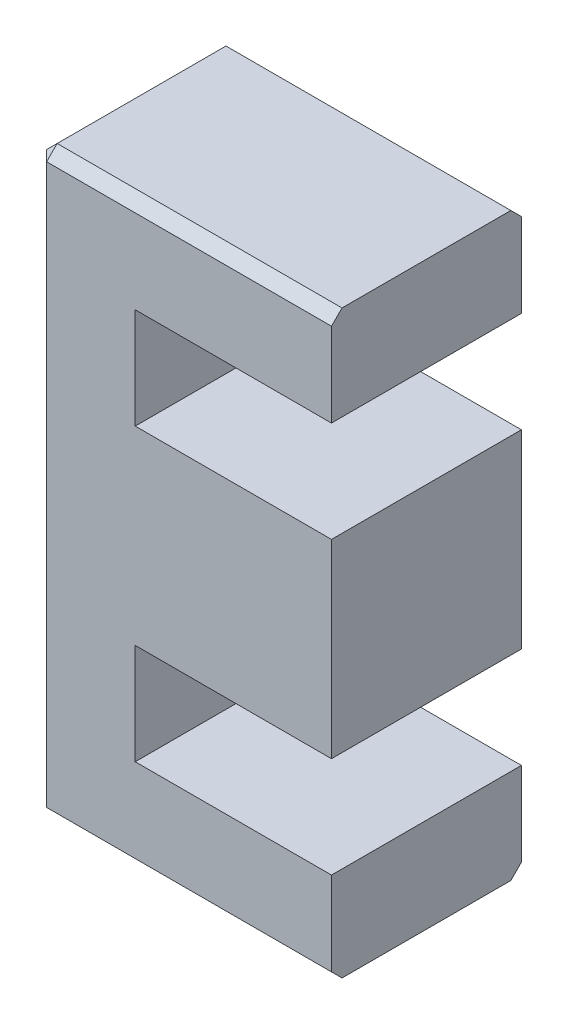
ISO-10303-21;
HEADER;
FILE_DESCRIPTION(('STEP AP214'),'2;1');
FILE_NAME('part.step','',(''),(''),'','','');
FILE_SCHEMA(('AUTOMOTIVE_DESIGN { 1 0 10303 214 1 1 1 1 }'));
ENDSEC;
DATA;
#1=APPLICATION_CONTEXT('core data for automotive mechanical design processes');
#2=APPLICATION_PROTOCOL_DEFINITION('international standard','automotive_design',2000,#1);
#3=PRODUCT_CONTEXT('',#1,'mechanical');
#4=PRODUCT('Part','Part','',(#3));
#5=PRODUCT_RELATED_PRODUCT_CATEGORY('part','',(#4));
#6=PRODUCT_DEFINITION_FORMATION('','',#4);
#7=PRODUCT_DEFINITION_CONTEXT('part definition',#1,'design');
#8=PRODUCT_DEFINITION('design','',#6,#7);
#9=PRODUCT_DEFINITION_SHAPE('','',#8);
#10=(LENGTH_UNIT() NAMED_UNIT(*) SI_UNIT(.MILLI.,.METRE.));
#11=(NAMED_UNIT(*) PLANE_ANGLE_UNIT() SI_UNIT($,.RADIAN.));
#12=(NAMED_UNIT(*) SI_UNIT($,.STERADIAN.) SOLID_ANGLE_UNIT());
#13=UNCERTAINTY_MEASURE_WITH_UNIT(LENGTH_MEASURE(1.E-05),#10,'distance_accuracy_value','');
#14=(GEOMETRIC_REPRESENTATION_CONTEXT(3) GLOBAL_UNCERTAINTY_ASSIGNED_CONTEXT((#13)) GLOBAL_UNIT_ASSIGNED_CONTEXT((#10,
#11,#12)) REPRESENTATION_CONTEXT('',''));
#15=CARTESIAN_POINT('',(0.,0.,0.));
#16=DIRECTION('',(0.,0.,1.));
#17=DIRECTION('',(1.,0.,0.));
#18=AXIS2_PLACEMENT_3D('',#15,#16,#17);
#19=CARTESIAN_POINT('',(28.,55.,18.));
#20=DIRECTION('',(-1.,0.,0.));
#21=DIRECTION('',(0.,0.,1.));
#22=AXIS2_PLACEMENT_3D('',#19,#20,#21);
#23=PLANE('',#22);
#24=DIRECTION('',(0.,1.,0.));
#25=VECTOR('',#24,1.);
#26=CARTESIAN_POINT('',(28.,55.,-18.));
#27=LINE('',#26,#25);
#28=CARTESIAN_POINT('',(28.,37.1,-18.));
#29=VERTEX_POINT('',#28);
#30=CARTESIAN_POINT('',(28.,53.,-18.));
#31=VERTEX_POINT('',#30);
#32=EDGE_CURVE('E206',#29,#31,#27,.T.);
#33=ORIENTED_EDGE('',*,*,#32,.T.);
#34=DIRECTION('',(0.,0.707106781186545,0.70710678118655));
#35=VECTOR('',#34,1.);
#36=CARTESIAN_POINT('',(28.,55.,-16.));
#37=LINE('',#36,#35);
#38=CARTESIAN_POINT('',(28.,55.,-16.));
#39=VERTEX_POINT('',#38);
#40=EDGE_CURVE('E11',#31,#39,#37,.T.);
#41=ORIENTED_EDGE('',*,*,#40,.T.);
#42=DIRECTION('',(0.,0.,-1.));
#43=VECTOR('',#42,1.);
#44=CARTESIAN_POINT('',(28.,55.,18.));
#45=LINE('',#44,#43);
#46=CARTESIAN_POINT('',(28.,55.,16.));
#47=VERTEX_POINT('',#46);
#48=EDGE_CURVE('E243',#47,#39,#45,.T.);
#49=ORIENTED_EDGE('',*,*,#48,.F.);
#50=DIRECTION('',(0.,0.707106781186545,-0.70710678118655));
#51=VECTOR('',#50,1.);
#52=CARTESIAN_POINT('',(28.,53.,18.));
#53=LINE('',#52,#51);
#54=CARTESIAN_POINT('',(28.,53.,18.));
#55=VERTEX_POINT('',#54);
#56=EDGE_CURVE('E49',#47,#55,#53,.F.);
#57=ORIENTED_EDGE('',*,*,#56,.T.);
#58=DIRECTION('',(0.,1.,0.));
#59=VECTOR('',#58,1.);
#60=CARTESIAN_POINT('',(28.,55.,18.));
#61=LINE('',#60,#59);
#62=CARTESIAN_POINT('',(28.,37.1,18.));
#63=VERTEX_POINT('',#62);
#64=EDGE_CURVE('E174',#63,#55,#61,.T.);
#65=ORIENTED_EDGE('',*,*,#64,.F.);
#66=DIRECTION('',(0.,0.,-1.));
#67=VECTOR('',#66,1.);
#68=CARTESIAN_POINT('',(28.,37.1,18.));
#69=LINE('',#68,#67);
#70=EDGE_CURVE('E205',#63,#29,#69,.T.);
#71=ORIENTED_EDGE('',*,*,#70,.T.);
#72=EDGE_LOOP('',(#33,#41,#49,#57,#65,#71));
#73=FACE_BOUND('',#72,.T.);
#74=ADVANCED_FACE('F39',(#73),#23,.F.);
#75=CARTESIAN_POINT('',(28.,55.,18.));
#76=DIRECTION('',(0.,-1.,0.));
#77=DIRECTION('',(0.,0.,-1.));
#78=AXIS2_PLACEMENT_3D('',#75,#76,#77);
#79=PLANE('',#78);
#80=ORIENTED_EDGE('',*,*,#48,.T.);
#81=DIRECTION('',(-1.,0.,0.));
#82=VECTOR('',#81,1.);
#83=CARTESIAN_POINT('',(-28.,55.,-16.));
#84=LINE('',#83,#82);
#85=CARTESIAN_POINT('',(-26.,55.,-16.));
#86=VERTEX_POINT('',#85);
#87=EDGE_CURVE('E57',#39,#86,#84,.T.);
#88=ORIENTED_EDGE('',*,*,#87,.T.);
#89=DIRECTION('',(0.,0.,1.));
#90=VECTOR('',#89,1.);
#91=CARTESIAN_POINT('',(-26.,55.,18.));
#92=LINE('',#91,#90);
#93=CARTESIAN_POINT('',(-26.,55.,16.));
#94=VERTEX_POINT('',#93);
#95=EDGE_CURVE('E61',#86,#94,#92,.T.);
#96=ORIENTED_EDGE('',*,*,#95,.T.);
#97=DIRECTION('',(1.,0.,0.));
#98=VECTOR('',#97,1.);
#99=CARTESIAN_POINT('',(28.,55.,16.));
#100=LINE('',#99,#98);
#101=EDGE_CURVE('E276',#94,#47,#100,.T.);
#102=ORIENTED_EDGE('',*,*,#101,.T.);
#103=EDGE_LOOP('',(#80,#88,#96,#102));
#104=FACE_BOUND('',#103,.T.);
#105=ADVANCED_FACE('F324',(#104),#79,.F.);
#106=CARTESIAN_POINT('',(-28.,55.,18.));
#107=DIRECTION('',(1.,0.,0.));
#108=DIRECTION('',(0.,0.,-1.));
#109=AXIS2_PLACEMENT_3D('',#106,#107,#108);
#110=PLANE('',#109);
#111=DIRECTION('',(0.,-1.,0.));
#112=VECTOR('',#111,1.);
#113=CARTESIAN_POINT('',(-28.,-55.,-16.));
#114=LINE('',#113,#112);
#115=CARTESIAN_POINT('',(-28.,53.,-16.));
#116=VERTEX_POINT('',#115);
#117=CARTESIAN_POINT('',(-28.,-53.,-16.));
#118=VERTEX_POINT('',#117);
#119=EDGE_CURVE('E269',#116,#118,#114,.T.);
#120=ORIENTED_EDGE('',*,*,#119,.T.);
#121=DIRECTION('',(0.,0.,1.));
#122=VECTOR('',#121,1.);
#123=CARTESIAN_POINT('',(-28.,-53.,18.));
#124=LINE('',#123,#122);
#125=CARTESIAN_POINT('',(-28.,-53.,16.));
#126=VERTEX_POINT('',#125);
#127=EDGE_CURVE('E273',#118,#126,#124,.T.);
#128=ORIENTED_EDGE('',*,*,#127,.T.);
#129=DIRECTION('',(0.,1.,0.));
#130=VECTOR('',#129,1.);
#131=CARTESIAN_POINT('',(-28.,55.,16.));
#132=LINE('',#131,#130);
#133=CARTESIAN_POINT('',(-28.,53.,16.));
#134=VERTEX_POINT('',#133);
#135=EDGE_CURVE('E271',#126,#134,#132,.T.);
#136=ORIENTED_EDGE('',*,*,#135,.T.);
#137=DIRECTION('',(0.,0.,-1.));
#138=VECTOR('',#137,1.);
#139=CARTESIAN_POINT('',(-28.,53.,18.));
#140=LINE('',#139,#138);
#141=EDGE_CURVE('E267',#134,#116,#140,.T.);
#142=ORIENTED_EDGE('',*,*,#141,.T.);
#143=EDGE_LOOP('',(#120,#128,#136,#142));
#144=FACE_BOUND('',#143,.T.);
#145=ADVANCED_FACE('F341',(#144),#110,.F.);
#146=CARTESIAN_POINT('',(28.,-55.,18.));
#147=DIRECTION('',(0.,1.,0.));
#148=DIRECTION('',(0.,0.,1.));
#149=AXIS2_PLACEMENT_3D('',#146,#147,#148);
#150=PLANE('',#149);
#151=DIRECTION('',(0.,0.,-1.));
#152=VECTOR('',#151,1.);
#153=CARTESIAN_POINT('',(-26.,-55.,18.));
#154=LINE('',#153,#152);
#155=CARTESIAN_POINT('',(-26.,-55.,16.));
#156=VERTEX_POINT('',#155);
#157=CARTESIAN_POINT('',(-26.,-55.,-16.));
#158=VERTEX_POINT('',#157);
#159=EDGE_CURVE('E245',#156,#158,#154,.T.);
#160=ORIENTED_EDGE('',*,*,#159,.T.);
#161=DIRECTION('',(1.,0.,0.));
#162=VECTOR('',#161,1.);
#163=CARTESIAN_POINT('',(28.,-55.,-16.));
#164=LINE('',#163,#162);
#165=CARTESIAN_POINT('',(28.,-55.,-16.));
#166=VERTEX_POINT('',#165);
#167=EDGE_CURVE('E249',#158,#166,#164,.T.);
#168=ORIENTED_EDGE('',*,*,#167,.T.);
#169=DIRECTION('',(0.,0.,-1.));
#170=VECTOR('',#169,1.);
#171=CARTESIAN_POINT('',(28.,-55.,18.));
#172=LINE('',#171,#170);
#173=CARTESIAN_POINT('',(28.,-55.,16.));
#174=VERTEX_POINT('',#173);
#175=EDGE_CURVE('E184',#174,#166,#172,.T.);
#176=ORIENTED_EDGE('',*,*,#175,.F.);
#177=DIRECTION('',(-1.,0.,0.));
#178=VECTOR('',#177,1.);
#179=CARTESIAN_POINT('',(28.,-55.,16.));
#180=LINE('',#179,#178);
#181=EDGE_CURVE('E247',#174,#156,#180,.T.);
#182=ORIENTED_EDGE('',*,*,#181,.T.);
#183=EDGE_LOOP('',(#160,#168,#176,#182));
#184=FACE_BOUND('',#183,.T.);
#185=ADVANCED_FACE('F354',(#184),#150,.F.);
#186=CARTESIAN_POINT('',(28.,-55.,18.));
#187=DIRECTION('',(-1.,0.,0.));
#188=DIRECTION('',(0.,0.,1.));
#189=AXIS2_PLACEMENT_3D('',#186,#187,#188);
#190=PLANE('',#189);
#191=ORIENTED_EDGE('',*,*,#175,.T.);
#192=DIRECTION('',(0.,0.70710678118655,-0.707106781186545));
#193=VECTOR('',#192,1.);
#194=CARTESIAN_POINT('',(28.,-55.,-16.));
#195=LINE('',#194,#193);
#196=CARTESIAN_POINT('',(28.,-53.,-18.));
#197=VERTEX_POINT('',#196);
#198=EDGE_CURVE('E254',#166,#197,#195,.T.);
#199=ORIENTED_EDGE('',*,*,#198,.T.);
#200=DIRECTION('',(0.,1.,0.));
#201=VECTOR('',#200,1.);
#202=CARTESIAN_POINT('',(28.,-55.,-18.));
#203=LINE('',#202,#201);
#204=CARTESIAN_POINT('',(28.,-37.1,-18.));
#205=VERTEX_POINT('',#204);
#206=EDGE_CURVE('E181',#197,#205,#203,.T.);
#207=ORIENTED_EDGE('',*,*,#206,.T.);
#208=DIRECTION('',(0.,0.,-1.));
#209=VECTOR('',#208,1.);
#210=CARTESIAN_POINT('',(28.,-37.1,18.));
#211=LINE('',#210,#209);
#212=CARTESIAN_POINT('',(28.,-37.1,18.));
#213=VERTEX_POINT('',#212);
#214=EDGE_CURVE('E177',#213,#205,#211,.T.);
#215=ORIENTED_EDGE('',*,*,#214,.F.);
#216=DIRECTION('',(0.,1.,0.));
#217=VECTOR('',#216,1.);
#218=CARTESIAN_POINT('',(28.,-55.,18.));
#219=LINE('',#218,#217);
#220=CARTESIAN_POINT('',(28.,-53.,18.));
#221=VERTEX_POINT('',#220);
#222=EDGE_CURVE('E164',#221,#213,#219,.T.);
#223=ORIENTED_EDGE('',*,*,#222,.F.);
#224=DIRECTION('',(0.,0.707106781186545,0.70710678118655));
#225=VECTOR('',#224,1.);
#226=CARTESIAN_POINT('',(28.,-53.,18.));
#227=LINE('',#226,#225);
#228=EDGE_CURVE('E252',#221,#174,#227,.F.);
#229=ORIENTED_EDGE('',*,*,#228,.T.);
#230=EDGE_LOOP('',(#191,#199,#207,#215,#223,#229));
#231=FACE_BOUND('',#230,.T.);
#232=ADVANCED_FACE('F179',(#231),#190,.F.);
#233=CARTESIAN_POINT('',(28.,-37.1,18.));
#234=DIRECTION('',(0.,-1.,0.));
#235=DIRECTION('',(1.,0.,0.));
#236=AXIS2_PLACEMENT_3D('',#233,#234,#235);
#237=PLANE('',#236);
#238=DIRECTION('',(-1.,0.,0.));
#239=VECTOR('',#238,1.);
#240=CARTESIAN_POINT('',(28.,-37.1,-18.));
#241=LINE('',#240,#239);
#242=CARTESIAN_POINT('',(-9.2,-37.1,-18.));
#243=VERTEX_POINT('',#242);
#244=EDGE_CURVE('E210',#205,#243,#241,.T.);
#245=ORIENTED_EDGE('',*,*,#244,.T.);
#246=DIRECTION('',(0.,0.,-1.));
#247=VECTOR('',#246,1.);
#248=CARTESIAN_POINT('',(-9.2,-37.1,18.));
#249=LINE('',#248,#247);
#250=CARTESIAN_POINT('',(-9.2,-37.1,18.));
#251=VERTEX_POINT('',#250);
#252=EDGE_CURVE('E185',#251,#243,#249,.T.);
#253=ORIENTED_EDGE('',*,*,#252,.F.);
#254=DIRECTION('',(-1.,0.,0.));
#255=VECTOR('',#254,1.);
#256=CARTESIAN_POINT('',(28.,-37.1,18.));
#257=LINE('',#256,#255);
#258=EDGE_CURVE('E168',#213,#251,#257,.T.);
#259=ORIENTED_EDGE('',*,*,#258,.F.);
#260=ORIENTED_EDGE('',*,*,#214,.T.);
#261=EDGE_LOOP('',(#245,#253,#259,#260));
#262=FACE_BOUND('',#261,.T.);
#263=ADVANCED_FACE('F187',(#262),#237,.F.);
#264=CARTESIAN_POINT('',(-9.2,-37.1,18.));
#265=DIRECTION('',(-1.,0.,0.));
#266=DIRECTION('',(0.,-1.,0.));
#267=AXIS2_PLACEMENT_3D('',#264,#265,#266);
#268=PLANE('',#267);
#269=DIRECTION('',(0.,1.,0.));
#270=VECTOR('',#269,1.);
#271=CARTESIAN_POINT('',(-9.2,-37.1,-18.));
#272=LINE('',#271,#270);
#273=CARTESIAN_POINT('',(-9.2,-18.,-18.));
#274=VERTEX_POINT('',#273);
#275=EDGE_CURVE('E212',#243,#274,#272,.T.);
#276=ORIENTED_EDGE('',*,*,#275,.T.);
#277=DIRECTION('',(0.,0.,-1.));
#278=VECTOR('',#277,1.);
#279=CARTESIAN_POINT('',(-9.2,-18.,18.));
#280=LINE('',#279,#278);
#281=CARTESIAN_POINT('',(-9.2,-18.,18.));
#282=VERTEX_POINT('',#281);
#283=EDGE_CURVE('E238',#282,#274,#280,.T.);
#284=ORIENTED_EDGE('',*,*,#283,.F.);
#285=DIRECTION('',(0.,1.,0.));
#286=VECTOR('',#285,1.);
#287=CARTESIAN_POINT('',(-9.2,-37.1,18.));
#288=LINE('',#287,#286);
#289=EDGE_CURVE('E190',#251,#282,#288,.T.);
#290=ORIENTED_EDGE('',*,*,#289,.F.);
#291=ORIENTED_EDGE('',*,*,#252,.T.);
#292=EDGE_LOOP('',(#276,#284,#290,#291));
#293=FACE_BOUND('',#292,.T.);
#294=ADVANCED_FACE('F368',(#293),#268,.F.);
#295=CARTESIAN_POINT('',(-9.2,-18.,18.));
#296=DIRECTION('',(0.,1.,0.));
#297=DIRECTION('',(0.,0.,1.));
#298=AXIS2_PLACEMENT_3D('',#295,#296,#297);
#299=PLANE('',#298);
#300=DIRECTION('',(1.,0.,0.));
#301=VECTOR('',#300,1.);
#302=CARTESIAN_POINT('',(-9.2,-18.,-18.));
#303=LINE('',#302,#301);
#304=CARTESIAN_POINT('',(28.,-18.,-18.));
#305=VERTEX_POINT('',#304);
#306=EDGE_CURVE('E214',#274,#305,#303,.T.);
#307=ORIENTED_EDGE('',*,*,#306,.T.);
#308=DIRECTION('',(0.,0.,-1.));
#309=VECTOR('',#308,1.);
#310=CARTESIAN_POINT('',(28.,-18.,18.));
#311=LINE('',#310,#309);
#312=CARTESIAN_POINT('',(28.,-18.,18.));
#313=VERTEX_POINT('',#312);
#314=EDGE_CURVE('E235',#313,#305,#311,.T.);
#315=ORIENTED_EDGE('',*,*,#314,.F.);
#316=DIRECTION('',(1.,0.,0.));
#317=VECTOR('',#316,1.);
#318=CARTESIAN_POINT('',(-9.2,-18.,18.));
#319=LINE('',#318,#317);
#320=EDGE_CURVE('E192',#282,#313,#319,.T.);
#321=ORIENTED_EDGE('',*,*,#320,.F.);
#322=ORIENTED_EDGE('',*,*,#283,.T.);
#323=EDGE_LOOP('',(#307,#315,#321,#322));
#324=FACE_BOUND('',#323,.T.);
#325=ADVANCED_FACE('F375',(#324),#299,.F.);
#326=CARTESIAN_POINT('',(28.,18.,18.));
#327=DIRECTION('',(-1.,0.,0.));
#328=DIRECTION('',(0.,0.,1.));
#329=AXIS2_PLACEMENT_3D('',#326,#327,#328);
#330=PLANE('',#329);
#331=DIRECTION('',(0.,1.,0.));
#332=VECTOR('',#331,1.);
#333=CARTESIAN_POINT('',(28.,18.,-18.));
#334=LINE('',#333,#332);
#335=CARTESIAN_POINT('',(28.,18.,-18.));
#336=VERTEX_POINT('',#335);
#337=EDGE_CURVE('E216',#305,#336,#334,.T.);
#338=ORIENTED_EDGE('',*,*,#337,.T.);
#339=DIRECTION('',(0.,0.,-1.));
#340=VECTOR('',#339,1.);
#341=CARTESIAN_POINT('',(28.,18.,18.));
#342=LINE('',#341,#340);
#343=CARTESIAN_POINT('',(28.,18.,18.));
#344=VERTEX_POINT('',#343);
#345=EDGE_CURVE('E232',#344,#336,#342,.T.);
#346=ORIENTED_EDGE('',*,*,#345,.F.);
#347=DIRECTION('',(0.,1.,0.));
#348=VECTOR('',#347,1.);
#349=CARTESIAN_POINT('',(28.,18.,18.));
#350=LINE('',#349,#348);
#351=EDGE_CURVE('E197',#313,#344,#350,.T.);
#352=ORIENTED_EDGE('',*,*,#351,.F.);
#353=ORIENTED_EDGE('',*,*,#314,.T.);
#354=EDGE_LOOP('',(#338,#346,#352,#353));
#355=FACE_BOUND('',#354,.T.);
#356=ADVANCED_FACE('F378',(#355),#330,.F.);
#357=CARTESIAN_POINT('',(-9.2,18.,18.));
#358=DIRECTION('',(0.,-1.,0.));
#359=DIRECTION('',(0.,0.,-1.));
#360=AXIS2_PLACEMENT_3D('',#357,#358,#359);
#361=PLANE('',#360);
#362=DIRECTION('',(-1.,0.,0.));
#363=VECTOR('',#362,1.);
#364=CARTESIAN_POINT('',(-9.2,18.,-18.));
#365=LINE('',#364,#363);
#366=CARTESIAN_POINT('',(-9.2,18.,-18.));
#367=VERTEX_POINT('',#366);
#368=EDGE_CURVE('E218',#336,#367,#365,.T.);
#369=ORIENTED_EDGE('',*,*,#368,.T.);
#370=DIRECTION('',(0.,0.,-1.));
#371=VECTOR('',#370,1.);
#372=CARTESIAN_POINT('',(-9.2,18.,18.));
#373=LINE('',#372,#371);
#374=CARTESIAN_POINT('',(-9.2,18.,18.));
#375=VERTEX_POINT('',#374);
#376=EDGE_CURVE('E229',#375,#367,#373,.T.);
#377=ORIENTED_EDGE('',*,*,#376,.F.);
#378=DIRECTION('',(-1.,0.,0.));
#379=VECTOR('',#378,1.);
#380=CARTESIAN_POINT('',(-9.2,18.,18.));
#381=LINE('',#380,#379);
#382=EDGE_CURVE('E199',#344,#375,#381,.T.);
#383=ORIENTED_EDGE('',*,*,#382,.F.);
#384=ORIENTED_EDGE('',*,*,#345,.T.);
#385=EDGE_LOOP('',(#369,#377,#383,#384));
#386=FACE_BOUND('',#385,.T.);
#387=ADVANCED_FACE('F383',(#386),#361,.F.);
#388=CARTESIAN_POINT('',(-9.2,37.1,18.));
#389=DIRECTION('',(-1.,0.,0.));
#390=DIRECTION('',(0.,-1.,0.));
#391=AXIS2_PLACEMENT_3D('',#388,#389,#390);
#392=PLANE('',#391);
#393=DIRECTION('',(0.,1.,0.));
#394=VECTOR('',#393,1.);
#395=CARTESIAN_POINT('',(-9.2,37.1,-18.));
#396=LINE('',#395,#394);
#397=CARTESIAN_POINT('',(-9.2,37.1,-18.));
#398=VERTEX_POINT('',#397);
#399=EDGE_CURVE('E220',#367,#398,#396,.T.);
#400=ORIENTED_EDGE('',*,*,#399,.T.);
#401=DIRECTION('',(0.,0.,-1.));
#402=VECTOR('',#401,1.);
#403=CARTESIAN_POINT('',(-9.2,37.1,18.));
#404=LINE('',#403,#402);
#405=CARTESIAN_POINT('',(-9.2,37.1,18.));
#406=VERTEX_POINT('',#405);
#407=EDGE_CURVE('E226',#406,#398,#404,.T.);
#408=ORIENTED_EDGE('',*,*,#407,.F.);
#409=DIRECTION('',(0.,1.,0.));
#410=VECTOR('',#409,1.);
#411=CARTESIAN_POINT('',(-9.2,37.1,18.));
#412=LINE('',#411,#410);
#413=EDGE_CURVE('E201',#375,#406,#412,.T.);
#414=ORIENTED_EDGE('',*,*,#413,.F.);
#415=ORIENTED_EDGE('',*,*,#376,.T.);
#416=EDGE_LOOP('',(#400,#408,#414,#415));
#417=FACE_BOUND('',#416,.T.);
#418=ADVANCED_FACE('F389',(#417),#392,.F.);
#419=CARTESIAN_POINT('',(28.,37.1,18.));
#420=DIRECTION('',(0.,1.,0.));
#421=DIRECTION('',(-1.,0.,0.));
#422=AXIS2_PLACEMENT_3D('',#419,#420,#421);
#423=PLANE('',#422);
#424=DIRECTION('',(1.,0.,0.));
#425=VECTOR('',#424,1.);
#426=CARTESIAN_POINT('',(28.,37.1,-18.));
#427=LINE('',#426,#425);
#428=EDGE_CURVE('E222',#398,#29,#427,.T.);
#429=ORIENTED_EDGE('',*,*,#428,.T.);
#430=ORIENTED_EDGE('',*,*,#70,.F.);
#431=DIRECTION('',(1.,0.,0.));
#432=VECTOR('',#431,1.);
#433=CARTESIAN_POINT('',(28.,37.1,18.));
#434=LINE('',#433,#432);
#435=EDGE_CURVE('E203',#406,#63,#434,.T.);
#436=ORIENTED_EDGE('',*,*,#435,.F.);
#437=ORIENTED_EDGE('',*,*,#407,.T.);
#438=EDGE_LOOP('',(#429,#430,#436,#437));
#439=FACE_BOUND('',#438,.T.);
#440=ADVANCED_FACE('F393',(#439),#423,.F.);
#441=CARTESIAN_POINT('',(0.,0.,18.));
#442=DIRECTION('',(0.,0.,-1.));
#443=DIRECTION('',(-1.,0.,0.));
#444=AXIS2_PLACEMENT_3D('',#441,#442,#443);
#445=PLANE('',#444);
#446=DIRECTION('',(0.,-1.,0.));
#447=VECTOR('',#446,1.);
#448=CARTESIAN_POINT('',(-26.,0.,18.));
#449=LINE('',#448,#447);
#450=CARTESIAN_POINT('',(-26.,53.,18.));
#451=VERTEX_POINT('',#450);
#452=CARTESIAN_POINT('',(-26.,-53.,18.));
#453=VERTEX_POINT('',#452);
#454=EDGE_CURVE('E264',#451,#453,#449,.T.);
#455=ORIENTED_EDGE('',*,*,#454,.T.);
#456=DIRECTION('',(1.,0.,0.));
#457=VECTOR('',#456,1.);
#458=CARTESIAN_POINT('',(0.,-53.,18.));
#459=LINE('',#458,#457);
#460=EDGE_CURVE('E171',#453,#221,#459,.T.);
#461=ORIENTED_EDGE('',*,*,#460,.T.);
#462=ORIENTED_EDGE('',*,*,#222,.T.);
#463=ORIENTED_EDGE('',*,*,#258,.T.);
#464=ORIENTED_EDGE('',*,*,#289,.T.);
#465=ORIENTED_EDGE('',*,*,#320,.T.);
#466=ORIENTED_EDGE('',*,*,#351,.T.);
#467=ORIENTED_EDGE('',*,*,#382,.T.);
#468=ORIENTED_EDGE('',*,*,#413,.T.);
#469=ORIENTED_EDGE('',*,*,#435,.T.);
#470=ORIENTED_EDGE('',*,*,#64,.T.);
#471=DIRECTION('',(-1.,0.,0.));
#472=VECTOR('',#471,1.);
#473=CARTESIAN_POINT('',(0.,53.,18.));
#474=LINE('',#473,#472);
#475=EDGE_CURVE('E262',#55,#451,#474,.T.);
#476=ORIENTED_EDGE('',*,*,#475,.T.);
#477=EDGE_LOOP('',(#455,#461,#462,#463,#464,#465,#466,#467,#468,#469,#470,#476));
#478=FACE_BOUND('',#477,.T.);
#479=ADVANCED_FACE('F166',(#478),#445,.F.);
#480=CARTESIAN_POINT('',(0.,0.,-18.));
#481=DIRECTION('',(0.,0.,-1.));
#482=DIRECTION('',(-1.,0.,0.));
#483=AXIS2_PLACEMENT_3D('',#480,#481,#482);
#484=PLANE('',#483);
#485=ORIENTED_EDGE('',*,*,#206,.F.);
#486=DIRECTION('',(-1.,0.,0.));
#487=VECTOR('',#486,1.);
#488=CARTESIAN_POINT('',(-28.,-53.,-18.));
#489=LINE('',#488,#487);
#490=CARTESIAN_POINT('',(-26.,-53.,-18.));
#491=VERTEX_POINT('',#490);
#492=EDGE_CURVE('E260',#197,#491,#489,.T.);
#493=ORIENTED_EDGE('',*,*,#492,.T.);
#494=DIRECTION('',(0.,1.,0.));
#495=VECTOR('',#494,1.);
#496=CARTESIAN_POINT('',(-26.,55.,-18.));
#497=LINE('',#496,#495);
#498=CARTESIAN_POINT('',(-26.,53.,-18.));
#499=VERTEX_POINT('',#498);
#500=EDGE_CURVE('E258',#491,#499,#497,.T.);
#501=ORIENTED_EDGE('',*,*,#500,.T.);
#502=DIRECTION('',(1.,0.,0.));
#503=VECTOR('',#502,1.);
#504=CARTESIAN_POINT('',(28.,53.,-18.));
#505=LINE('',#504,#503);
#506=EDGE_CURVE('E256',#499,#31,#505,.T.);
#507=ORIENTED_EDGE('',*,*,#506,.T.);
#508=ORIENTED_EDGE('',*,*,#32,.F.);
#509=ORIENTED_EDGE('',*,*,#428,.F.);
#510=ORIENTED_EDGE('',*,*,#399,.F.);
#511=ORIENTED_EDGE('',*,*,#368,.F.);
#512=ORIENTED_EDGE('',*,*,#337,.F.);
#513=ORIENTED_EDGE('',*,*,#306,.F.);
#514=ORIENTED_EDGE('',*,*,#275,.F.);
#515=ORIENTED_EDGE('',*,*,#244,.F.);
#516=EDGE_LOOP('',(#485,#493,#501,#507,#508,#509,#510,#511,#512,#513,#514,#515));
#517=FACE_BOUND('',#516,.T.);
#518=ADVANCED_FACE('F363',(#517),#484,.T.);
#519=CARTESIAN_POINT('',(0.,53.,18.));
#520=DIRECTION('',(0.,-0.70710678118655,-0.707106781186545));
#521=DIRECTION('',(-1.,0.,0.));
#522=AXIS2_PLACEMENT_3D('',#519,#520,#521);
#523=PLANE('',#522);
#524=DIRECTION('',(0.,-0.707106781186545,0.70710678118655));
#525=VECTOR('',#524,1.);
#526=CARTESIAN_POINT('',(-26.,54.,17.));
#527=LINE('',#526,#525);
#528=EDGE_CURVE('E44',#451,#94,#527,.F.);
#529=ORIENTED_EDGE('',*,*,#528,.F.);
#530=ORIENTED_EDGE('',*,*,#475,.F.);
#531=ORIENTED_EDGE('',*,*,#56,.F.);
#532=ORIENTED_EDGE('',*,*,#101,.F.);
#533=EDGE_LOOP('',(#529,#530,#531,#532));
#534=FACE_BOUND('',#533,.T.);
#535=ADVANCED_FACE('F42',(#534),#523,.F.);
#536=CARTESIAN_POINT('',(-28.,53.,16.));
#537=DIRECTION('',(-0.577350269189626,0.57735026918963,0.577350269189622));
#538=DIRECTION('',(-0.70710678118655,-0.707106781186545,0.));
#539=AXIS2_PLACEMENT_3D('',#536,#537,#538);
#540=PLANE('',#539);
#541=DIRECTION('',(-0.707106781186545,0.,-0.70710678118655));
#542=VECTOR('',#541,1.);
#543=CARTESIAN_POINT('',(-28.,53.,16.));
#544=LINE('',#543,#542);
#545=EDGE_CURVE('E307',#451,#134,#544,.T.);
#546=ORIENTED_EDGE('',*,*,#545,.F.);
#547=ORIENTED_EDGE('',*,*,#528,.T.);
#548=DIRECTION('',(0.70710678118655,0.707106781186545,0.));
#549=VECTOR('',#548,1.);
#550=CARTESIAN_POINT('',(-28.,53.,16.));
#551=LINE('',#550,#549);
#552=EDGE_CURVE('E309',#134,#94,#551,.T.);
#553=ORIENTED_EDGE('',*,*,#552,.F.);
#554=EDGE_LOOP('',(#546,#547,#553));
#555=FACE_BOUND('',#554,.T.);
#556=ADVANCED_FACE('F318',(#555),#540,.T.);
#557=CARTESIAN_POINT('',(28.,55.,-16.));
#558=DIRECTION('',(0.,0.70710678118655,-0.707106781186545));
#559=DIRECTION('',(1.,0.,0.));
#560=AXIS2_PLACEMENT_3D('',#557,#558,#559);
#561=PLANE('',#560);
#562=ORIENTED_EDGE('',*,*,#40,.F.);
#563=ORIENTED_EDGE('',*,*,#506,.F.);
#564=DIRECTION('',(0.,-0.707106781186545,-0.70710678118655));
#565=VECTOR('',#564,1.);
#566=CARTESIAN_POINT('',(-26.,53.,-18.));
#567=LINE('',#566,#565);
#568=EDGE_CURVE('E304',#86,#499,#567,.T.);
#569=ORIENTED_EDGE('',*,*,#568,.F.);
#570=ORIENTED_EDGE('',*,*,#87,.F.);
#571=EDGE_LOOP('',(#562,#563,#569,#570));
#572=FACE_BOUND('',#571,.T.);
#573=ADVANCED_FACE('F332',(#572),#561,.T.);
#574=CARTESIAN_POINT('',(-28.,53.,18.));
#575=DIRECTION('',(0.707106781186545,-0.70710678118655,0.));
#576=DIRECTION('',(0.,0.,-1.));
#577=AXIS2_PLACEMENT_3D('',#574,#575,#576);
#578=PLANE('',#577);
#579=ORIENTED_EDGE('',*,*,#552,.T.);
#580=ORIENTED_EDGE('',*,*,#95,.F.);
#581=DIRECTION('',(-0.70710678118655,-0.707106781186545,0.));
#582=VECTOR('',#581,1.);
#583=CARTESIAN_POINT('',(-27.,54.,-16.));
#584=LINE('',#583,#582);
#585=EDGE_CURVE('E301',#116,#86,#584,.F.);
#586=ORIENTED_EDGE('',*,*,#585,.F.);
#587=ORIENTED_EDGE('',*,*,#141,.F.);
#588=EDGE_LOOP('',(#579,#580,#586,#587));
#589=FACE_BOUND('',#588,.T.);
#590=ADVANCED_FACE('F339',(#589),#578,.F.);
#591=CARTESIAN_POINT('',(-26.,0.,18.));
#592=DIRECTION('',(0.70710678118655,0.,-0.707106781186545));
#593=DIRECTION('',(0.,-1.,0.));
#594=AXIS2_PLACEMENT_3D('',#591,#592,#593);
#595=PLANE('',#594);
#596=ORIENTED_EDGE('',*,*,#545,.T.);
#597=ORIENTED_EDGE('',*,*,#135,.F.);
#598=DIRECTION('',(0.707106781186545,0.,0.70710678118655));
#599=VECTOR('',#598,1.);
#600=CARTESIAN_POINT('',(-27.,-53.,17.));
#601=LINE('',#600,#599);
#602=EDGE_CURVE('E298',#453,#126,#601,.F.);
#603=ORIENTED_EDGE('',*,*,#602,.F.);
#604=ORIENTED_EDGE('',*,*,#454,.F.);
#605=EDGE_LOOP('',(#596,#597,#603,#604));
#606=FACE_BOUND('',#605,.T.);
#607=ADVANCED_FACE('F346',(#606),#595,.F.);
#608=CARTESIAN_POINT('',(0.,-53.,18.));
#609=DIRECTION('',(0.,0.70710678118655,-0.707106781186545));
#610=DIRECTION('',(1.,0.,0.));
#611=AXIS2_PLACEMENT_3D('',#608,#609,#610);
#612=PLANE('',#611);
#613=ORIENTED_EDGE('',*,*,#228,.F.);
#614=ORIENTED_EDGE('',*,*,#460,.F.);
#615=DIRECTION('',(0.,-0.707106781186545,-0.70710678118655));
#616=VECTOR('',#615,1.);
#617=CARTESIAN_POINT('',(-26.,-55.,16.));
#618=LINE('',#617,#616);
#619=EDGE_CURVE('E295',#156,#453,#618,.F.);
#620=ORIENTED_EDGE('',*,*,#619,.F.);
#621=ORIENTED_EDGE('',*,*,#181,.F.);
#622=EDGE_LOOP('',(#613,#614,#620,#621));
#623=FACE_BOUND('',#622,.T.);
#624=ADVANCED_FACE('F349',(#623),#612,.F.);
#625=CARTESIAN_POINT('',(-26.,53.,-18.));
#626=DIRECTION('',(-0.577350269189622,0.57735026918963,-0.577350269189626));
#627=DIRECTION('',(0.,0.707106781186545,0.70710678118655));
#628=AXIS2_PLACEMENT_3D('',#625,#626,#627);
#629=PLANE('',#628);
#630=ORIENTED_EDGE('',*,*,#585,.T.);
#631=ORIENTED_EDGE('',*,*,#568,.T.);
#632=DIRECTION('',(-0.70710678118655,0.,0.707106781186545));
#633=VECTOR('',#632,1.);
#634=CARTESIAN_POINT('',(-26.,53.,-18.));
#635=LINE('',#634,#633);
#636=EDGE_CURVE('E292',#116,#499,#635,.F.);
#637=ORIENTED_EDGE('',*,*,#636,.F.);
#638=EDGE_LOOP('',(#630,#631,#637));
#639=FACE_BOUND('',#638,.T.);
#640=ADVANCED_FACE('F337',(#639),#629,.T.);
#641=CARTESIAN_POINT('',(-26.,-55.,16.));
#642=DIRECTION('',(-0.57735026918963,-0.577350269189626,0.577350269189622));
#643=DIRECTION('',(0.707106781186545,-0.70710678118655,0.));
#644=AXIS2_PLACEMENT_3D('',#641,#642,#643);
#645=PLANE('',#644);
#646=ORIENTED_EDGE('',*,*,#619,.T.);
#647=ORIENTED_EDGE('',*,*,#602,.T.);
#648=DIRECTION('',(-0.707106781186545,0.70710678118655,0.));
#649=VECTOR('',#648,1.);
#650=CARTESIAN_POINT('',(-26.,-55.,16.));
#651=LINE('',#650,#649);
#652=EDGE_CURVE('E290',#156,#126,#651,.T.);
#653=ORIENTED_EDGE('',*,*,#652,.F.);
#654=EDGE_LOOP('',(#646,#647,#653));
#655=FACE_BOUND('',#654,.T.);
#656=ADVANCED_FACE('F402',(#655),#645,.T.);
#657=CARTESIAN_POINT('',(-28.,55.,-16.));
#658=DIRECTION('',(-0.707106781186545,0.,-0.70710678118655));
#659=DIRECTION('',(0.,1.,0.));
#660=AXIS2_PLACEMENT_3D('',#657,#658,#659);
#661=PLANE('',#660);
#662=ORIENTED_EDGE('',*,*,#636,.T.);
#663=ORIENTED_EDGE('',*,*,#500,.F.);
#664=DIRECTION('',(0.70710678118655,0.,-0.707106781186545));
#665=VECTOR('',#664,1.);
#666=CARTESIAN_POINT('',(-26.,-53.,-18.));
#667=LINE('',#666,#665);
#668=EDGE_CURVE('E287',#118,#491,#667,.T.);
#669=ORIENTED_EDGE('',*,*,#668,.F.);
#670=ORIENTED_EDGE('',*,*,#119,.F.);
#671=EDGE_LOOP('',(#662,#663,#669,#670));
#672=FACE_BOUND('',#671,.T.);
#673=ADVANCED_FACE('F396',(#672),#661,.T.);
#674=CARTESIAN_POINT('',(-26.,-55.,18.));
#675=DIRECTION('',(0.70710678118655,0.707106781186545,0.));
#676=DIRECTION('',(0.,0.,-1.));
#677=AXIS2_PLACEMENT_3D('',#674,#675,#676);
#678=PLANE('',#677);
#679=ORIENTED_EDGE('',*,*,#652,.T.);
#680=ORIENTED_EDGE('',*,*,#127,.F.);
#681=DIRECTION('',(0.707106781186545,-0.70710678118655,0.));
#682=VECTOR('',#681,1.);
#683=CARTESIAN_POINT('',(-27.,-54.,-16.));
#684=LINE('',#683,#682);
#685=EDGE_CURVE('E284',#158,#118,#684,.F.);
#686=ORIENTED_EDGE('',*,*,#685,.F.);
#687=ORIENTED_EDGE('',*,*,#159,.F.);
#688=EDGE_LOOP('',(#679,#680,#686,#687));
#689=FACE_BOUND('',#688,.T.);
#690=ADVANCED_FACE('F400',(#689),#678,.F.);
#691=CARTESIAN_POINT('',(-26.,-53.,-18.));
#692=DIRECTION('',(-0.577350269189626,-0.577350269189622,-0.57735026918963));
#693=DIRECTION('',(-0.70710678118655,0.,0.707106781186545));
#694=AXIS2_PLACEMENT_3D('',#691,#692,#693);
#695=PLANE('',#694);
#696=ORIENTED_EDGE('',*,*,#685,.T.);
#697=ORIENTED_EDGE('',*,*,#668,.T.);
#698=DIRECTION('',(0.,-0.70710678118655,0.707106781186545));
#699=VECTOR('',#698,1.);
#700=CARTESIAN_POINT('',(-26.,-53.,-18.));
#701=LINE('',#700,#699);
#702=EDGE_CURVE('E281',#158,#491,#701,.F.);
#703=ORIENTED_EDGE('',*,*,#702,.F.);
#704=EDGE_LOOP('',(#696,#697,#703));
#705=FACE_BOUND('',#704,.T.);
#706=ADVANCED_FACE('F398',(#705),#695,.T.);
#707=CARTESIAN_POINT('',(28.,-55.,-16.));
#708=DIRECTION('',(0.,-0.707106781186545,-0.70710678118655));
#709=DIRECTION('',(-1.,0.,0.));
#710=AXIS2_PLACEMENT_3D('',#707,#708,#709);
#711=PLANE('',#710);
#712=ORIENTED_EDGE('',*,*,#702,.T.);
#713=ORIENTED_EDGE('',*,*,#492,.F.);
#714=ORIENTED_EDGE('',*,*,#198,.F.);
#715=ORIENTED_EDGE('',*,*,#167,.F.);
#716=EDGE_LOOP('',(#712,#713,#714,#715));
#717=FACE_BOUND('',#716,.T.);
#718=ADVANCED_FACE('F359',(#717),#711,.T.);
#719=CLOSED_SHELL('',(#74,#105,#145,#185,#232,#263,#294,#325,#356,#387,#418,#440,#479,#518,#535,
#556,#573,#590,#607,#624,#640,#656,#673,#690,#706,#718));
#720=MANIFOLD_SOLID_BREP('B2',#719);
#721=ADVANCED_BREP_SHAPE_REPRESENTATION('',(#18,#720),#14);
#722=SHAPE_DEFINITION_REPRESENTATION(#9,#721);
ENDSEC;
END-ISO-10303-21;
